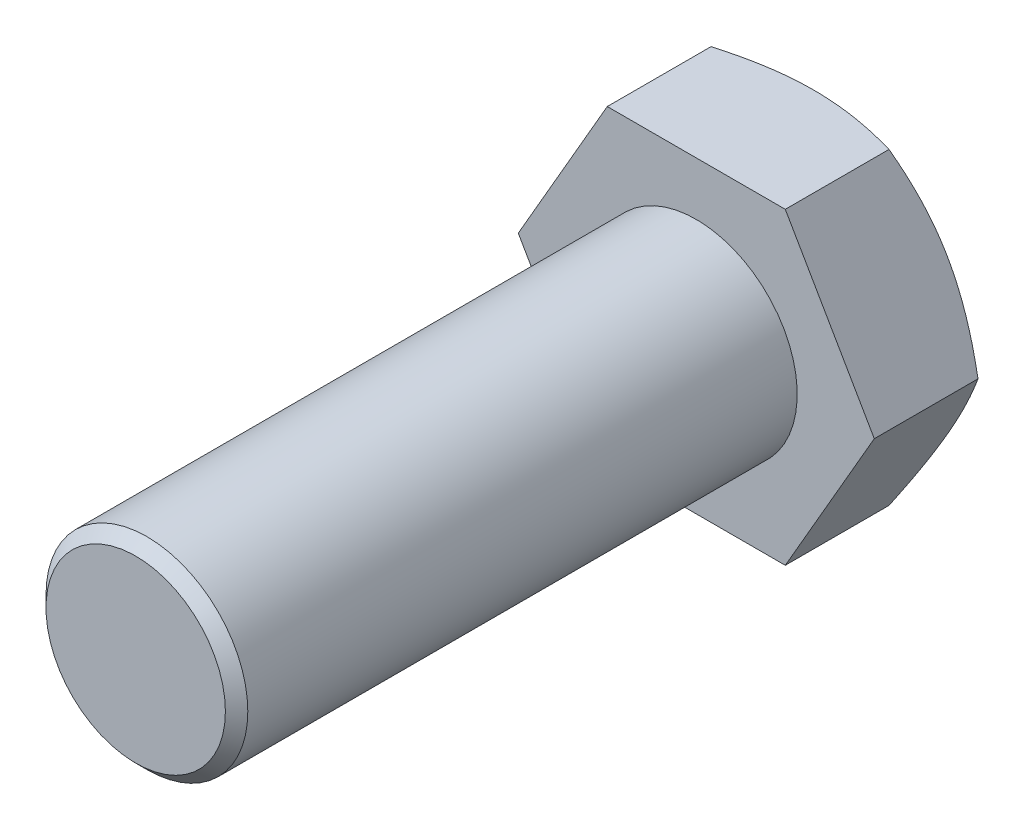
ISO-10303-21;
HEADER;
FILE_DESCRIPTION(('STEP AP214'),'2;1');
FILE_NAME('part.step','',(''),(''),'','','');
FILE_SCHEMA(('AUTOMOTIVE_DESIGN { 1 0 10303 214 1 1 1 1 }'));
ENDSEC;
DATA;
#1=APPLICATION_CONTEXT('core data for automotive mechanical design processes');
#2=APPLICATION_PROTOCOL_DEFINITION('international standard','automotive_design',2000,#1);
#3=PRODUCT_CONTEXT('',#1,'mechanical');
#4=PRODUCT('Part','Part','',(#3));
#5=PRODUCT_RELATED_PRODUCT_CATEGORY('part','',(#4));
#6=PRODUCT_DEFINITION_FORMATION('','',#4);
#7=PRODUCT_DEFINITION_CONTEXT('part definition',#1,'design');
#8=PRODUCT_DEFINITION('design','',#6,#7);
#9=PRODUCT_DEFINITION_SHAPE('','',#8);
#10=(LENGTH_UNIT() NAMED_UNIT(*) SI_UNIT(.MILLI.,.METRE.));
#11=(NAMED_UNIT(*) PLANE_ANGLE_UNIT() SI_UNIT($,.RADIAN.));
#12=(NAMED_UNIT(*) SI_UNIT($,.STERADIAN.) SOLID_ANGLE_UNIT());
#13=UNCERTAINTY_MEASURE_WITH_UNIT(LENGTH_MEASURE(1.E-05),#10,'distance_accuracy_value','');
#14=(GEOMETRIC_REPRESENTATION_CONTEXT(3) GLOBAL_UNCERTAINTY_ASSIGNED_CONTEXT((#13)) GLOBAL_UNIT_ASSIGNED_CONTEXT((#10,
#11,#12)) REPRESENTATION_CONTEXT('',''));
#15=CARTESIAN_POINT('',(0.,0.,0.));
#16=DIRECTION('',(0.,0.,1.));
#17=DIRECTION('',(1.,0.,0.));
#18=AXIS2_PLACEMENT_3D('',#15,#16,#17);
#19=CARTESIAN_POINT('',(15.8771324027147,-27.5,22.5));
#20=DIRECTION('',(-0.866025403784439,0.5,0.));
#21=DIRECTION('',(-0.5,-0.866025403784439,0.));
#22=AXIS2_PLACEMENT_3D('',#19,#20,#21);
#23=PLANE('',#22);
#24=CARTESIAN_POINT('',(31.7543802754833,0.000200000000014275,4.0000666670303));
#25=CARTESIAN_POINT('',(31.4054079553827,-0.604237788849373,3.79860242506894));
#26=CARTESIAN_POINT('',(31.0550744575329,-1.21103320671861,3.60628041248676));
#27=CARTESIAN_POINT('',(30.3515982095276,-2.42948981018163,3.24246204392051));
#28=CARTESIAN_POINT('',(29.9984545758749,-3.04115252603763,3.0709725374349));
#29=CARTESIAN_POINT('',(29.288668030154,-4.27053888575502,2.75112097915205));
#30=CARTESIAN_POINT('',(28.9320188501902,-4.8882733859301,2.60281415665774));
#31=CARTESIAN_POINT('',(28.2162574458172,-6.128008504401,2.33252283850917));
#32=CARTESIAN_POINT('',(27.8571454704538,-6.75000869133673,2.21053572066545));
#33=CARTESIAN_POINT('',(27.1456376531005,-7.9823763809752,1.99806197872558));
#34=CARTESIAN_POINT('',(26.7932945869289,-8.59265247327895,1.90687270210693));
#35=CARTESIAN_POINT('',(26.0869940021723,-9.81600097149301,1.75396926252744));
#36=CARTESIAN_POINT('',(25.7330364526428,-10.4290734310007,1.69225566693789));
#37=CARTESIAN_POINT('',(25.0245267818511,-11.6562481784659,1.59986182625365));
#38=CARTESIAN_POINT('',(24.66997587095,-12.2703483700163,1.56914470488069));
#39=CARTESIAN_POINT('',(23.960546874664,-13.4991154359462,1.53940437569927));
#40=CARTESIAN_POINT('',(23.6056687997282,-14.1137822922274,1.54038018849997));
#41=CARTESIAN_POINT('',(22.9422198524702,-15.2629095771062,1.57181198485078));
#42=CARTESIAN_POINT('',(22.6336017259233,-15.7974518524223,1.59843513827466));
#43=CARTESIAN_POINT('',(22.0171022601112,-16.8652602500478,1.67514515891808));
#44=CARTESIAN_POINT('',(21.7092209103562,-17.3985263905264,1.7252316900525));
#45=CARTESIAN_POINT('',(21.0943087503184,-18.4635854939038,1.84800042236973));
#46=CARTESIAN_POINT('',(20.7872789634531,-18.9953766841916,1.92070305585214));
#47=CARTESIAN_POINT('',(20.1746894958628,-20.0564127662394,2.08741729206136));
#48=CARTESIAN_POINT('',(19.8691298089152,-20.5856576687775,2.18142880450926));
#49=CARTESIAN_POINT('',(18.9415157523796,-22.1923323445123,2.49783930923249));
#50=CARTESIAN_POINT('',(18.3220968849487,-23.2651972940693,2.75180503572447));
#51=CARTESIAN_POINT('',(17.3998090934324,-24.8626466081761,3.18416962621692));
#52=CARTESIAN_POINT('',(17.0937841912214,-25.3926972871868,3.33670490708894));
#53=CARTESIAN_POINT('',(16.4838511067448,-26.4491323787176,3.65721775994824));
#54=CARTESIAN_POINT('',(16.1799423537135,-26.9755177798326,3.82519097955908));
#55=CARTESIAN_POINT('',(15.8770169326609,-27.5002,4.0000666670303));
#56=B_SPLINE_CURVE_WITH_KNOTS('',3,(#24,#25,#26,#27,#28,#29,#30,#31,#32,#33,#34,#35,#36,#37,#38,
#39,#40,#41,#42,#43,#44,#45,#46,#47,#48,#49,#50,#51,#52,#53,#54,#55),.UNSPECIFIED.,.F.,.F.,(4,2,
2,2,2,2,2,2,2,2,2,2,2,2,2,4),(0.,2.17937596004525,4.35946654657184,6.54467421858153,
8.72966408126494,10.8607692974364,12.9919155331585,15.120523359995,17.2490654075945,
19.1020483557859,20.9550047630006,22.8096400916025,24.6642675628548,28.4552152198911,
30.3473870339695,32.2390270200263),.UNSPECIFIED.);
#57=CARTESIAN_POINT('',(31.7542648054294,0.,4.));
#58=VERTEX_POINT('',#57);
#59=CARTESIAN_POINT('',(15.8771324027147,-27.5,4.));
#60=VERTEX_POINT('',#59);
#61=EDGE_CURVE('E82',#58,#60,#56,.T.);
#62=ORIENTED_EDGE('',*,*,#61,.F.);
#63=DIRECTION('',(0.,0.,-1.));
#64=VECTOR('',#63,1.);
#65=CARTESIAN_POINT('',(31.7542648054294,0.,22.5));
#66=LINE('',#65,#64);
#67=CARTESIAN_POINT('',(31.7542648054294,0.,22.5));
#68=VERTEX_POINT('',#67);
#69=EDGE_CURVE('E106',#68,#58,#66,.T.);
#70=ORIENTED_EDGE('',*,*,#69,.F.);
#71=DIRECTION('',(0.5,0.866025403784439,0.));
#72=VECTOR('',#71,1.);
#73=CARTESIAN_POINT('',(15.8771324027147,-27.5,22.5));
#74=LINE('',#73,#72);
#75=CARTESIAN_POINT('',(15.8771324027147,-27.5,22.5));
#76=VERTEX_POINT('',#75);
#77=EDGE_CURVE('E105',#76,#68,#74,.T.);
#78=ORIENTED_EDGE('',*,*,#77,.F.);
#79=DIRECTION('',(0.,0.,-1.));
#80=VECTOR('',#79,1.);
#81=CARTESIAN_POINT('',(15.8771324027147,-27.5,22.5));
#82=LINE('',#81,#80);
#83=EDGE_CURVE('E98',#76,#60,#82,.T.);
#84=ORIENTED_EDGE('',*,*,#83,.T.);
#85=EDGE_LOOP('',(#62,#70,#78,#84));
#86=FACE_BOUND('',#85,.T.);
#87=ADVANCED_FACE('F34',(#86),#23,.F.);
#88=CARTESIAN_POINT('',(31.7542648054294,0.,22.5));
#89=DIRECTION('',(-0.866025403784438,-0.5,0.));
#90=DIRECTION('',(0.5,-0.866025403784439,0.));
#91=AXIS2_PLACEMENT_3D('',#88,#89,#90);
#92=PLANE('',#91);
#93=CARTESIAN_POINT('',(15.8770169326609,27.5002,4.0000666670303));
#94=CARTESIAN_POINT('',(16.2259892527614,26.8957622111506,3.79860242506894));
#95=CARTESIAN_POINT('',(16.5763227506113,26.2889667932814,3.60628041248676));
#96=CARTESIAN_POINT('',(17.2797989986165,25.0705101898184,3.24246204392051));
#97=CARTESIAN_POINT('',(17.6329426322693,24.4588474739624,3.0709725374349));
#98=CARTESIAN_POINT('',(18.3427291779901,23.229461114245,2.75112097915205));
#99=CARTESIAN_POINT('',(18.6993783579539,22.6117266140699,2.60281415665775));
#100=CARTESIAN_POINT('',(19.4151397623269,21.371991495599,2.33252283850918));
#101=CARTESIAN_POINT('',(19.7742517376903,20.7499913086633,2.21053572066545));
#102=CARTESIAN_POINT('',(20.4857595550437,19.5176236190248,1.99806197872559));
#103=CARTESIAN_POINT('',(20.8381026212152,18.9073475267211,1.90687270210693));
#104=CARTESIAN_POINT('',(21.5444032059718,17.683999028507,1.75396926252744));
#105=CARTESIAN_POINT('',(21.8983607555014,17.0709265689993,1.6922556669379));
#106=CARTESIAN_POINT('',(22.6068704262931,15.8437518215341,1.59986182625366));
#107=CARTESIAN_POINT('',(22.9614213371941,15.2296516299837,1.56914470488069));
#108=CARTESIAN_POINT('',(23.6708503334801,14.0008845640538,1.53940437569927));
#109=CARTESIAN_POINT('',(24.025728408416,13.3862177077726,1.54038018849998));
#110=CARTESIAN_POINT('',(24.6891773556739,12.2370904228938,1.57181198485078));
#111=CARTESIAN_POINT('',(24.9977954822209,11.7025481475777,1.59843513827466));
#112=CARTESIAN_POINT('',(25.6142949480329,10.6347397499522,1.67514515891808));
#113=CARTESIAN_POINT('',(25.9221762977879,10.1014736094737,1.72523169005251));
#114=CARTESIAN_POINT('',(26.5370884578257,9.03641450609622,1.84800042236974));
#115=CARTESIAN_POINT('',(26.8441182446911,8.50462331580839,1.92070305585215));
#116=CARTESIAN_POINT('',(27.4567077122813,7.44358723376059,2.08741729206136));
#117=CARTESIAN_POINT('',(27.7622673992289,6.91434233122251,2.18142880450927));
#118=CARTESIAN_POINT('',(28.6898814557645,5.30766765548771,2.49783930923249));
#119=CARTESIAN_POINT('',(29.3093003231954,4.23480270593066,2.75180503572448));
#120=CARTESIAN_POINT('',(30.2315881147117,2.63735339182394,3.18416962621692));
#121=CARTESIAN_POINT('',(30.5376130169227,2.10730271281317,3.33670490708894));
#122=CARTESIAN_POINT('',(31.1475461013994,1.0508676212824,3.65721775994825));
#123=CARTESIAN_POINT('',(31.4514548544306,0.524482220167436,3.82519097955908));
#124=CARTESIAN_POINT('',(31.7543802754833,-0.000199999999984533,4.0000666670303));
#125=B_SPLINE_CURVE_WITH_KNOTS('',3,(#93,#94,#95,#96,#97,#98,#99,#100,#101,#102,#103,#104,#105,
#106,#107,#108,#109,#110,#111,#112,#113,#114,#115,#116,#117,#118,#119,#120,#121,#122,#123,#124),
.UNSPECIFIED.,.F.,.F.,(4,2,2,2,2,2,2,2,2,2,2,2,2,2,2,4),(0.,2.17937596004525,4.35946654657184,
6.54467421858153,8.72966408126494,10.8607692974364,12.9919155331585,15.120523359995,
17.2490654075945,19.1020483557859,20.9550047630006,22.8096400916025,24.6642675628548,
28.4552152198911,30.3473870339695,32.2390270200263),.UNSPECIFIED.);
#126=CARTESIAN_POINT('',(15.8771324027147,27.5,4.));
#127=VERTEX_POINT('',#126);
#128=EDGE_CURVE('E49',#127,#58,#125,.T.);
#129=ORIENTED_EDGE('',*,*,#128,.F.);
#130=DIRECTION('',(0.,0.,-1.));
#131=VECTOR('',#130,1.);
#132=CARTESIAN_POINT('',(15.8771324027147,27.5,22.5));
#133=LINE('',#132,#131);
#134=CARTESIAN_POINT('',(15.8771324027147,27.5,22.5));
#135=VERTEX_POINT('',#134);
#136=EDGE_CURVE('E108',#135,#127,#133,.T.);
#137=ORIENTED_EDGE('',*,*,#136,.F.);
#138=DIRECTION('',(-0.5,0.866025403784438,0.));
#139=VECTOR('',#138,1.);
#140=CARTESIAN_POINT('',(31.7542648054294,0.,22.5));
#141=LINE('',#140,#139);
#142=EDGE_CURVE('E132',#68,#135,#141,.T.);
#143=ORIENTED_EDGE('',*,*,#142,.F.);
#144=ORIENTED_EDGE('',*,*,#69,.T.);
#145=EDGE_LOOP('',(#129,#137,#143,#144));
#146=FACE_BOUND('',#145,.T.);
#147=ADVANCED_FACE('F178',(#146),#92,.F.);
#148=CARTESIAN_POINT('',(15.8771324027147,27.5,22.5));
#149=DIRECTION('',(0.,-1.,0.));
#150=DIRECTION('',(1.,0.,0.));
#151=AXIS2_PLACEMENT_3D('',#148,#149,#150);
#152=PLANE('',#151);
#153=CARTESIAN_POINT('',(-41.8947454678366,27.5,14.6000366617363));
#154=CARTESIAN_POINT('',(-41.2972373909663,27.5,14.3116534517566));
#155=CARTESIAN_POINT('',(-40.6990068929886,27.5,14.0247623738564));
#156=CARTESIAN_POINT('',(-39.5009511300616,27.5,13.4543136502321));
#157=CARTESIAN_POINT('',(-38.9011258479095,27.5,13.1707560406461));
#158=CARTESIAN_POINT('',(-37.699644265307,27.5,12.6072831310829));
#159=CARTESIAN_POINT('',(-37.0979876786622,27.5,12.3273684407369));
#160=CARTESIAN_POINT('',(-35.8927818899799,27.5,11.7716495819908));
#161=CARTESIAN_POINT('',(-35.2892326926426,27.5,11.4958454033925));
#162=CARTESIAN_POINT('',(-33.4685027344423,27.5,10.6721240752368));
#163=CARTESIAN_POINT('',(-32.2481635726962,27.5,10.1311578779396));
#164=CARTESIAN_POINT('',(-29.7975060167707,27.5,9.0723649083398));
#165=CARTESIAN_POINT('',(-28.5671881213292,27.5,8.55453698790237));
#166=CARTESIAN_POINT('',(-26.6944828297253,27.5,7.79238620628073));
#167=CARTESIAN_POINT('',(-26.0564838638613,27.5,7.53726979622732));
#168=CARTESIAN_POINT('',(-24.7770243788651,27.5,7.03588145327263));
#169=CARTESIAN_POINT('',(-24.1355639157578,27.5,6.78960937771539));
#170=CARTESIAN_POINT('',(-22.8487781022656,27.5,6.30705873165252));
#171=CARTESIAN_POINT('',(-22.2034521877735,27.5,6.07078166244334));
#172=CARTESIAN_POINT('',(-20.9087477586919,27.5,5.609636589235));
#173=CARTESIAN_POINT('',(-20.259369341555,27.5,5.38476831206084));
#174=CARTESIAN_POINT('',(-18.957662124008,27.5,4.94846055805869));
#175=CARTESIAN_POINT('',(-18.3053427862327,27.5,4.73699299433834));
#176=CARTESIAN_POINT('',(-16.9961481428003,27.5,4.32871044661211));
#177=CARTESIAN_POINT('',(-16.3392727572,27.5,4.1318957204288));
#178=CARTESIAN_POINT('',(-14.361833697016,27.5,3.56639269386102));
#179=CARTESIAN_POINT('',(-13.0339381127029,27.5,3.22246847936502));
#180=CARTESIAN_POINT('',(-11.031434756771,27.5,2.76996204973804));
#181=CARTESIAN_POINT('',(-10.3638442239196,27.5,2.62996226799984));
#182=CARTESIAN_POINT('',(-9.02424446808466,27.5,2.37283291197602));
#183=CARTESIAN_POINT('',(-8.35223534476824,27.5,2.25570282365141));
#184=CARTESIAN_POINT('',(-7.0043332360254,27.5,2.04642483892903));
#185=CARTESIAN_POINT('',(-6.32844032392664,27.5,1.95427647243757));
#186=CARTESIAN_POINT('',(-4.97351254051255,27.5,1.79682019393029));
#187=CARTESIAN_POINT('',(-4.29447766919676,27.5,1.73151228191837));
#188=CARTESIAN_POINT('',(-2.94278198682926,27.5,1.62981846339272));
#189=CARTESIAN_POINT('',(-2.27014780593405,27.5,1.59308070477978));
#190=CARTESIAN_POINT('',(-0.923932546833292,27.5,1.54801975808308));
#191=CARTESIAN_POINT('',(-0.250351483717539,27.5,1.53969612220565));
#192=CARTESIAN_POINT('',(1.0965696784698,27.5,1.55166026690573));
#193=CARTESIAN_POINT('',(1.76990977333863,27.5,1.57194852429789));
#194=CARTESIAN_POINT('',(3.11515843216522,27.5,1.64065650370869));
#195=CARTESIAN_POINT('',(3.78706692981889,27.5,1.68907750143552));
#196=CARTESIAN_POINT('',(5.42532233336094,27.5,1.84043981947151));
#197=CARTESIAN_POINT('',(6.39033802104638,27.5,1.95802743528601));
#198=CARTESIAN_POINT('',(8.31270703745941,27.5,2.24464081506787));
#199=CARTESIAN_POINT('',(9.27005920453821,27.5,2.41367423122309));
#200=CARTESIAN_POINT('',(11.1763609746558,27.5,2.79716440636782));
#201=CARTESIAN_POINT('',(12.1253029502191,27.5,3.0116587223953));
#202=CARTESIAN_POINT('',(14.0134303866352,27.5,3.47957263526603));
#203=CARTESIAN_POINT('',(14.9526160440281,27.5,3.73299144634874));
#204=CARTESIAN_POINT('',(16.8415518462086,27.5,4.27853159327815));
#205=CARTESIAN_POINT('',(17.7910937558704,27.5,4.57136903835435));
#206=CARTESIAN_POINT('',(19.6808199103929,27.5,5.18567361532166));
#207=CARTESIAN_POINT('',(20.6210040951731,27.5,5.50714093089684));
#208=CARTESIAN_POINT('',(22.4925084364906,27.5,6.17374483703701));
#209=CARTESIAN_POINT('',(23.4238317765158,27.5,6.51887253076572));
#210=CARTESIAN_POINT('',(25.2788712866893,27.5,7.22889736074899));
#211=CARTESIAN_POINT('',(26.2025875272759,27.5,7.59379431371171));
#212=CARTESIAN_POINT('',(28.300023820881,27.5,8.44412832791786));
#213=CARTESIAN_POINT('',(29.4716178131359,27.5,8.93480023200263));
#214=CARTESIAN_POINT('',(31.8055987556465,27.5,9.93763024061144));
#215=CARTESIAN_POINT('',(32.9679852561527,27.5,10.4497893871018));
#216=CARTESIAN_POINT('',(35.2851719751702,27.5,11.4914928346583));
#217=CARTESIAN_POINT('',(36.4399708060819,27.5,12.0210402149412));
#218=CARTESIAN_POINT('',(38.7429827226563,27.5,13.0941875355533));
#219=CARTESIAN_POINT('',(39.8911959173483,27.5,13.6377872424121));
#220=CARTESIAN_POINT('',(42.1831397378351,27.5,14.7370414347066));
#221=CARTESIAN_POINT('',(43.3268652133734,27.5,15.2927066415259));
#222=CARTESIAN_POINT('',(45.6096076210853,27.5,16.4136234156035));
#223=CARTESIAN_POINT('',(46.7486245374791,27.5,16.9788750149565));
#224=CARTESIAN_POINT('',(49.0225272272282,27.5,18.1173354761567));
#225=CARTESIAN_POINT('',(50.1574134050976,27.5,18.6905435308553));
#226=CARTESIAN_POINT('',(52.4237428699914,27.5,19.8437164397739));
#227=CARTESIAN_POINT('',(53.5551861621289,27.5,20.4236812839531));
#228=CARTESIAN_POINT('',(55.7274104822851,27.5,21.5441204259652));
#229=CARTESIAN_POINT('',(56.7684126856515,27.5,22.0841662241522));
#230=CARTESIAN_POINT('',(58.8482068048337,27.5,23.1684985960758));
#231=CARTESIAN_POINT('',(59.8869987172166,27.5,23.7127851763925));
#232=CARTESIAN_POINT('',(63.000524713802,27.5,25.3511917747704));
#233=CARTESIAN_POINT('',(65.072355804398,27.5,26.4508311076314));
#234=CARTESIAN_POINT('',(68.173332769684,27.5,28.1076119477957));
#235=CARTESIAN_POINT('',(69.204759854292,27.5,28.6604950978634));
#236=CARTESIAN_POINT('',(71.2662623123325,27.5,29.7687778050727));
#237=CARTESIAN_POINT('',(72.2963376853073,27.5,30.324177363066));
#238=CARTESIAN_POINT('',(74.3552332450533,27.5,31.4371812281622));
#239=CARTESIAN_POINT('',(75.3840534887651,27.5,31.9947854299817));
#240=CARTESIAN_POINT('',(77.4406063539136,27.5,33.111992360419));
#241=CARTESIAN_POINT('',(78.4683389770089,27.5,33.6715950859835));
#242=CARTESIAN_POINT('',(79.4955887943185,27.5,34.2320817881131));
#243=B_SPLINE_CURVE_WITH_KNOTS('',3,(#153,#154,#155,#156,#157,#158,#159,#160,#161,#162,#163,
#164,#165,#166,#167,#168,#169,#170,#171,#172,#173,#174,#175,#176,#177,#178,#179,#180,#181,#182,
#183,#184,#185,#186,#187,#188,#189,#190,#191,#192,#193,#194,#195,#196,#197,#198,#199,#200,#201,
#202,#203,#204,#205,#206,#207,#208,#209,#210,#211,#212,#213,#214,#215,#216,#217,#218,#219,#220,
#221,#222,#223,#224,#225,#226,#227,#228,#229,#230,#231,#232,#233,#234,#235,#236,#237,#238,#239,
#240,#241,#242),.UNSPECIFIED.,.F.,.F.,(4,2,2,2,2,2,2,2,2,2,2,2,2,2,2,2,2,2,2,2,2,2,2,2,2,2,2,2,
2,2,2,2,2,2,2,2,2,2,2,2,2,2,2,2,4),(0.,1.99038444929256,3.98079045650995,5.97152537634549,
7.96225535635473,11.9666718953306,15.9708895116643,18.0321811133201,20.0934394521325,
22.155006310082,24.2165237820354,26.2735668873462,28.3306461786082,32.4431610730889,
34.4891829306632,36.5351587947861,38.5810961560741,40.6270335176602,42.6473568208031,
44.6676482844216,46.6879734164152,48.7083901692911,51.6232202935196,54.53848418955,
57.4561659535506,60.3737888266659,63.3542610743565,66.3347524455965,69.3141291676776,
72.2934782710205,76.1037752784245,79.9142572700439,83.7254177238481,87.5365148983341,
91.3511496986098,95.1657972725791,98.9800606545812,102.794318369202,106.312547641374,
109.830782373659,116.867431695817,120.378226684208,123.889022860959,127.399653356415,
130.910278490591),.UNSPECIFIED.);
#244=CARTESIAN_POINT('',(-15.8771324027147,27.5,4.));
#245=VERTEX_POINT('',#244);
#246=EDGE_CURVE('E54',#245,#127,#243,.T.);
#247=ORIENTED_EDGE('',*,*,#246,.F.);
#248=DIRECTION('',(0.,0.,-1.));
#249=VECTOR('',#248,1.);
#250=CARTESIAN_POINT('',(-15.8771324027147,27.5,22.5));
#251=LINE('',#250,#249);
#252=CARTESIAN_POINT('',(-15.8771324027147,27.5,22.5));
#253=VERTEX_POINT('',#252);
#254=EDGE_CURVE('E192',#253,#245,#251,.T.);
#255=ORIENTED_EDGE('',*,*,#254,.F.);
#256=DIRECTION('',(-1.,0.,0.));
#257=VECTOR('',#256,1.);
#258=CARTESIAN_POINT('',(15.8771324027147,27.5,22.5));
#259=LINE('',#258,#257);
#260=EDGE_CURVE('E130',#135,#253,#259,.T.);
#261=ORIENTED_EDGE('',*,*,#260,.F.);
#262=ORIENTED_EDGE('',*,*,#136,.T.);
#263=EDGE_LOOP('',(#247,#255,#261,#262));
#264=FACE_BOUND('',#263,.T.);
#265=ADVANCED_FACE('F174',(#264),#152,.F.);
#266=CARTESIAN_POINT('',(-15.8771324027147,27.5,22.5));
#267=DIRECTION('',(0.866025403784439,-0.5,0.));
#268=DIRECTION('',(0.5,0.866025403784439,0.));
#269=AXIS2_PLACEMENT_3D('',#266,#267,#268);
#270=PLANE('',#269);
#271=CARTESIAN_POINT('',(-31.7543802754833,-0.000200000000003744,4.0000666670303));
#272=CARTESIAN_POINT('',(-31.4054079553827,0.604237788849384,3.79860242506894));
#273=CARTESIAN_POINT('',(-31.0550744575329,1.21103320671862,3.60628041248676));
#274=CARTESIAN_POINT('',(-30.3515982095276,2.42948981018164,3.24246204392051));
#275=CARTESIAN_POINT('',(-29.9984545758749,3.04115252603764,3.0709725374349));
#276=CARTESIAN_POINT('',(-29.288668030154,4.27053888575503,2.75112097915205));
#277=CARTESIAN_POINT('',(-28.9320188501902,4.88827338593011,2.60281415665775));
#278=CARTESIAN_POINT('',(-28.2162574458172,6.128008504401,2.33252283850918));
#279=CARTESIAN_POINT('',(-27.8571454704538,6.75000869133674,2.21053572066545));
#280=CARTESIAN_POINT('',(-27.1456376531005,7.98237638097521,1.99806197872558));
#281=CARTESIAN_POINT('',(-26.7932945869289,8.59265247327896,1.90687270210693));
#282=CARTESIAN_POINT('',(-26.0869940021723,9.81600097149303,1.75396926252744));
#283=CARTESIAN_POINT('',(-25.7330364526428,10.4290734310007,1.69225566693789));
#284=CARTESIAN_POINT('',(-25.0245267818511,11.6562481784659,1.59986182625366));
#285=CARTESIAN_POINT('',(-24.66997587095,12.2703483700163,1.56914470488069));
#286=CARTESIAN_POINT('',(-23.960546874664,13.4991154359462,1.53940437569927));
#287=CARTESIAN_POINT('',(-23.6056687997282,14.1137822922274,1.54038018849997));
#288=CARTESIAN_POINT('',(-22.9422198524702,15.2629095771062,1.57181198485078));
#289=CARTESIAN_POINT('',(-22.6336017259233,15.7974518524223,1.59843513827466));
#290=CARTESIAN_POINT('',(-22.0171022601112,16.8652602500478,1.67514515891808));
#291=CARTESIAN_POINT('',(-21.7092209103562,17.3985263905264,1.7252316900525));
#292=CARTESIAN_POINT('',(-21.0943087503184,18.4635854939038,1.84800042236974));
#293=CARTESIAN_POINT('',(-20.787278963453,18.9953766841916,1.92070305585214));
#294=CARTESIAN_POINT('',(-20.1746894958628,20.0564127662394,2.08741729206136));
#295=CARTESIAN_POINT('',(-19.8691298089152,20.5856576687775,2.18142880450927));
#296=CARTESIAN_POINT('',(-18.9415157523796,22.1923323445123,2.49783930923249));
#297=CARTESIAN_POINT('',(-18.3220968849487,23.2651972940694,2.75180503572448));
#298=CARTESIAN_POINT('',(-17.3998090934324,24.8626466081761,3.18416962621692));
#299=CARTESIAN_POINT('',(-17.0937841912214,25.3926972871868,3.33670490708894));
#300=CARTESIAN_POINT('',(-16.4838511067448,26.4491323787176,3.65721775994825));
#301=CARTESIAN_POINT('',(-16.1799423537135,26.9755177798326,3.82519097955908));
#302=CARTESIAN_POINT('',(-15.8770169326609,27.5002,4.0000666670303));
#303=B_SPLINE_CURVE_WITH_KNOTS('',3,(#271,#272,#273,#274,#275,#276,#277,#278,#279,#280,#281,
#282,#283,#284,#285,#286,#287,#288,#289,#290,#291,#292,#293,#294,#295,#296,#297,#298,#299,#300,
#301,#302),.UNSPECIFIED.,.F.,.F.,(4,2,2,2,2,2,2,2,2,2,2,2,2,2,2,4),(0.,2.17937596004525,
4.35946654657184,6.54467421858153,8.72966408126494,10.8607692974364,12.9919155331585,
15.120523359995,17.2490654075945,19.1020483557859,20.9550047630006,22.8096400916025,
24.6642675628548,28.4552152198911,30.3473870339695,32.2390270200263),.UNSPECIFIED.);
#304=CARTESIAN_POINT('',(-31.7542648054294,0.,4.));
#305=VERTEX_POINT('',#304);
#306=EDGE_CURVE('E165',#305,#245,#303,.T.);
#307=ORIENTED_EDGE('',*,*,#306,.F.);
#308=DIRECTION('',(0.,0.,-1.));
#309=VECTOR('',#308,1.);
#310=CARTESIAN_POINT('',(-31.7542648054294,0.,22.5));
#311=LINE('',#310,#309);
#312=CARTESIAN_POINT('',(-31.7542648054294,0.,22.5));
#313=VERTEX_POINT('',#312);
#314=EDGE_CURVE('E194',#313,#305,#311,.T.);
#315=ORIENTED_EDGE('',*,*,#314,.F.);
#316=DIRECTION('',(-0.5,-0.866025403784439,0.));
#317=VECTOR('',#316,1.);
#318=CARTESIAN_POINT('',(-15.8771324027147,27.5,22.5));
#319=LINE('',#318,#317);
#320=EDGE_CURVE('E128',#253,#313,#319,.T.);
#321=ORIENTED_EDGE('',*,*,#320,.F.);
#322=ORIENTED_EDGE('',*,*,#254,.T.);
#323=EDGE_LOOP('',(#307,#315,#321,#322));
#324=FACE_BOUND('',#323,.T.);
#325=ADVANCED_FACE('F177',(#324),#270,.F.);
#326=CARTESIAN_POINT('',(-31.7542648054294,0.,22.5));
#327=DIRECTION('',(0.866025403784438,0.5,0.));
#328=DIRECTION('',(-0.5,0.866025403784439,0.));
#329=AXIS2_PLACEMENT_3D('',#326,#327,#328);
#330=PLANE('',#329);
#331=CARTESIAN_POINT('',(-15.8770169326609,-27.5002,4.0000666670303));
#332=CARTESIAN_POINT('',(-16.2259892527614,-26.8957622111506,3.79860242506893));
#333=CARTESIAN_POINT('',(-16.5763227506113,-26.2889667932814,3.60628041248676));
#334=CARTESIAN_POINT('',(-17.2797989986165,-25.0705101898184,3.2424620439205));
#335=CARTESIAN_POINT('',(-17.6329426322692,-24.4588474739624,3.0709725374349));
#336=CARTESIAN_POINT('',(-18.3427291779901,-23.229461114245,2.75112097915205));
#337=CARTESIAN_POINT('',(-18.6993783579539,-22.6117266140699,2.60281415665774));
#338=CARTESIAN_POINT('',(-19.4151397623269,-21.371991495599,2.33252283850917));
#339=CARTESIAN_POINT('',(-19.7742517376903,-20.7499913086633,2.21053572066544));
#340=CARTESIAN_POINT('',(-20.4857595550437,-19.5176236190248,1.99806197872558));
#341=CARTESIAN_POINT('',(-20.8381026212152,-18.907347526721,1.90687270210693));
#342=CARTESIAN_POINT('',(-21.5444032059718,-17.683999028507,1.75396926252744));
#343=CARTESIAN_POINT('',(-21.8983607555014,-17.0709265689993,1.69225566693789));
#344=CARTESIAN_POINT('',(-22.6068704262931,-15.8437518215341,1.59986182625365));
#345=CARTESIAN_POINT('',(-22.9614213371941,-15.2296516299837,1.56914470488069));
#346=CARTESIAN_POINT('',(-23.6708503334801,-14.0008845640538,1.53940437569927));
#347=CARTESIAN_POINT('',(-24.025728408416,-13.3862177077726,1.54038018849997));
#348=CARTESIAN_POINT('',(-24.6891773556739,-12.2370904228938,1.57181198485078));
#349=CARTESIAN_POINT('',(-24.9977954822209,-11.7025481475777,1.59843513827465));
#350=CARTESIAN_POINT('',(-25.6142949480329,-10.6347397499522,1.67514515891808));
#351=CARTESIAN_POINT('',(-25.9221762977879,-10.1014736094736,1.7252316900525));
#352=CARTESIAN_POINT('',(-26.5370884578257,-9.03641450609622,1.84800042236974));
#353=CARTESIAN_POINT('',(-26.8441182446911,-8.50462331580839,1.92070305585214));
#354=CARTESIAN_POINT('',(-27.4567077122813,-7.44358723376058,2.08741729206136));
#355=CARTESIAN_POINT('',(-27.7622673992289,-6.9143423312225,2.18142880450927));
#356=CARTESIAN_POINT('',(-28.6898814557645,-5.3076676554877,2.49783930923249));
#357=CARTESIAN_POINT('',(-29.3093003231954,-4.23480270593065,2.75180503572447));
#358=CARTESIAN_POINT('',(-30.2315881147117,-2.63735339182392,3.18416962621692));
#359=CARTESIAN_POINT('',(-30.5376130169227,-2.10730271281316,3.33670490708894));
#360=CARTESIAN_POINT('',(-31.1475461013994,-1.05086762128239,3.65721775994825));
#361=CARTESIAN_POINT('',(-31.4514548544306,-0.524482220167425,3.82519097955908));
#362=CARTESIAN_POINT('',(-31.7543802754833,0.000199999999995443,4.0000666670303));
#363=B_SPLINE_CURVE_WITH_KNOTS('',3,(#331,#332,#333,#334,#335,#336,#337,#338,#339,#340,#341,
#342,#343,#344,#345,#346,#347,#348,#349,#350,#351,#352,#353,#354,#355,#356,#357,#358,#359,#360,
#361,#362),.UNSPECIFIED.,.F.,.F.,(4,2,2,2,2,2,2,2,2,2,2,2,2,2,2,4),(0.,2.17937596004525,
4.35946654657184,6.54467421858153,8.72966408126494,10.8607692974364,12.9919155331585,
15.120523359995,17.2490654075945,19.1020483557859,20.9550047630006,22.8096400916025,
24.6642675628548,28.4552152198911,30.3473870339695,32.2390270200263),.UNSPECIFIED.);
#364=CARTESIAN_POINT('',(-15.8771324027147,-27.5,4.));
#365=VERTEX_POINT('',#364);
#366=EDGE_CURVE('E102',#365,#305,#363,.T.);
#367=ORIENTED_EDGE('',*,*,#366,.F.);
#368=DIRECTION('',(0.,0.,-1.));
#369=VECTOR('',#368,1.);
#370=CARTESIAN_POINT('',(-15.8771324027147,-27.5,22.5));
#371=LINE('',#370,#369);
#372=CARTESIAN_POINT('',(-15.8771324027147,-27.5,22.5));
#373=VERTEX_POINT('',#372);
#374=EDGE_CURVE('E101',#373,#365,#371,.T.);
#375=ORIENTED_EDGE('',*,*,#374,.F.);
#376=DIRECTION('',(0.5,-0.866025403784439,0.));
#377=VECTOR('',#376,1.);
#378=CARTESIAN_POINT('',(-31.7542648054294,0.,22.5));
#379=LINE('',#378,#377);
#380=EDGE_CURVE('E126',#313,#373,#379,.T.);
#381=ORIENTED_EDGE('',*,*,#380,.F.);
#382=ORIENTED_EDGE('',*,*,#314,.T.);
#383=EDGE_LOOP('',(#367,#375,#381,#382));
#384=FACE_BOUND('',#383,.T.);
#385=ADVANCED_FACE('F200',(#384),#330,.F.);
#386=CARTESIAN_POINT('',(-15.8771324027147,-27.5,22.5));
#387=DIRECTION('',(0.,1.,0.));
#388=DIRECTION('',(0.,0.,1.));
#389=AXIS2_PLACEMENT_3D('',#386,#387,#388);
#390=PLANE('',#389);
#391=CARTESIAN_POINT('',(-41.8947454678366,-27.5,14.6000366617363));
#392=CARTESIAN_POINT('',(-41.2972373909663,-27.5,14.3116534517566));
#393=CARTESIAN_POINT('',(-40.6990068929886,-27.5,14.0247623738564));
#394=CARTESIAN_POINT('',(-39.5009511300616,-27.5,13.4543136502321));
#395=CARTESIAN_POINT('',(-38.9011258479095,-27.5,13.1707560406461));
#396=CARTESIAN_POINT('',(-37.699644265307,-27.5,12.6072831310829));
#397=CARTESIAN_POINT('',(-37.0979876786622,-27.5,12.3273684407369));
#398=CARTESIAN_POINT('',(-35.8927818899799,-27.5,11.7716495819908));
#399=CARTESIAN_POINT('',(-35.2892326926426,-27.5,11.4958454033925));
#400=CARTESIAN_POINT('',(-33.4685027344423,-27.5,10.6721240752368));
#401=CARTESIAN_POINT('',(-32.2481635726962,-27.5,10.1311578779396));
#402=CARTESIAN_POINT('',(-29.7975060167707,-27.5,9.0723649083398));
#403=CARTESIAN_POINT('',(-28.5671881213292,-27.5,8.55453698790237));
#404=CARTESIAN_POINT('',(-26.6944828297253,-27.5,7.79238620628073));
#405=CARTESIAN_POINT('',(-26.0564838638613,-27.5,7.53726979622732));
#406=CARTESIAN_POINT('',(-24.7770243788651,-27.5,7.03588145327263));
#407=CARTESIAN_POINT('',(-24.1355639157578,-27.5,6.78960937771539));
#408=CARTESIAN_POINT('',(-22.8487781022656,-27.5,6.30705873165252));
#409=CARTESIAN_POINT('',(-22.2034521877735,-27.5,6.07078166244334));
#410=CARTESIAN_POINT('',(-20.9087477586919,-27.5,5.609636589235));
#411=CARTESIAN_POINT('',(-20.259369341555,-27.5,5.38476831206084));
#412=CARTESIAN_POINT('',(-18.957662124008,-27.5,4.94846055805869));
#413=CARTESIAN_POINT('',(-18.3053427862326,-27.5,4.73699299433834));
#414=CARTESIAN_POINT('',(-16.9961481428003,-27.5,4.32871044661211));
#415=CARTESIAN_POINT('',(-16.3392727572,-27.5,4.13189572042879));
#416=CARTESIAN_POINT('',(-14.361833697016,-27.5,3.56639269386102));
#417=CARTESIAN_POINT('',(-13.0339381127028,-27.5,3.22246847936502));
#418=CARTESIAN_POINT('',(-11.031434756771,-27.5,2.76996204973804));
#419=CARTESIAN_POINT('',(-10.3638442239196,-27.5,2.62996226799983));
#420=CARTESIAN_POINT('',(-9.02424446808464,-27.5,2.37283291197601));
#421=CARTESIAN_POINT('',(-8.35223534476823,-27.5,2.2557028236514));
#422=CARTESIAN_POINT('',(-7.00433323602539,-27.5,2.04642483892902));
#423=CARTESIAN_POINT('',(-6.32844032392662,-27.5,1.95427647243757));
#424=CARTESIAN_POINT('',(-4.97351254051253,-27.5,1.79682019393028));
#425=CARTESIAN_POINT('',(-4.29447766919675,-27.5,1.73151228191837));
#426=CARTESIAN_POINT('',(-2.94278198682925,-27.5,1.62981846339272));
#427=CARTESIAN_POINT('',(-2.27014780593405,-27.5,1.59308070477978));
#428=CARTESIAN_POINT('',(-0.923932546833284,-27.5,1.54801975808307));
#429=CARTESIAN_POINT('',(-0.250351483717531,-27.5,1.53969612220564));
#430=CARTESIAN_POINT('',(1.09656967846981,-27.5,1.55166026690572));
#431=CARTESIAN_POINT('',(1.76990977333864,-27.5,1.57194852429788));
#432=CARTESIAN_POINT('',(3.11515843216523,-27.5,1.64065650370869));
#433=CARTESIAN_POINT('',(3.78706692981889,-27.5,1.68907750143552));
#434=CARTESIAN_POINT('',(5.42532233336095,-27.5,1.8404398194715));
#435=CARTESIAN_POINT('',(6.39033802104638,-27.5,1.95802743528601));
#436=CARTESIAN_POINT('',(8.31270703745942,-27.5,2.24464081506787));
#437=CARTESIAN_POINT('',(9.27005920453822,-27.5,2.41367423122309));
#438=CARTESIAN_POINT('',(11.1763609746558,-27.5,2.79716440636782));
#439=CARTESIAN_POINT('',(12.1253029502191,-27.5,3.01165872239529));
#440=CARTESIAN_POINT('',(14.0134303866352,-27.5,3.47957263526602));
#441=CARTESIAN_POINT('',(14.9526160440281,-27.5,3.73299144634873));
#442=CARTESIAN_POINT('',(16.8415518462086,-27.5,4.27853159327814));
#443=CARTESIAN_POINT('',(17.7910937558704,-27.5,4.57136903835435));
#444=CARTESIAN_POINT('',(19.6808199103929,-27.5,5.18567361532165));
#445=CARTESIAN_POINT('',(20.6210040951731,-27.5,5.50714093089683));
#446=CARTESIAN_POINT('',(22.4925084364906,-27.5,6.17374483703701));
#447=CARTESIAN_POINT('',(23.4238317765158,-27.5,6.51887253076572));
#448=CARTESIAN_POINT('',(25.2788712866893,-27.5,7.22889736074899));
#449=CARTESIAN_POINT('',(26.2025875272759,-27.5,7.59379431371171));
#450=CARTESIAN_POINT('',(28.300023820881,-27.5,8.44412832791786));
#451=CARTESIAN_POINT('',(29.4716178131359,-27.5,8.93480023200264));
#452=CARTESIAN_POINT('',(31.8055987556465,-27.5,9.93763024061144));
#453=CARTESIAN_POINT('',(32.9679852561527,-27.5,10.4497893871018));
#454=CARTESIAN_POINT('',(35.2851719751702,-27.5,11.4914928346583));
#455=CARTESIAN_POINT('',(36.439970806082,-27.5,12.0210402149412));
#456=CARTESIAN_POINT('',(38.7429827226564,-27.5,13.0941875355533));
#457=CARTESIAN_POINT('',(39.8911959173483,-27.5,13.6377872424121));
#458=CARTESIAN_POINT('',(42.1831397378352,-27.5,14.7370414347066));
#459=CARTESIAN_POINT('',(43.3268652133735,-27.5,15.2927066415259));
#460=CARTESIAN_POINT('',(45.6096076210854,-27.5,16.4136234156035));
#461=CARTESIAN_POINT('',(46.7486245374792,-27.5,16.9788750149565));
#462=CARTESIAN_POINT('',(49.0225272272282,-27.5,18.1173354761567));
#463=CARTESIAN_POINT('',(50.1574134050976,-27.5,18.6905435308553));
#464=CARTESIAN_POINT('',(52.4237428699915,-27.5,19.8437164397739));
#465=CARTESIAN_POINT('',(53.5551861621289,-27.5,20.4236812839531));
#466=CARTESIAN_POINT('',(55.7274104822851,-27.5,21.5441204259652));
#467=CARTESIAN_POINT('',(56.7684126856516,-27.5,22.0841662241523));
#468=CARTESIAN_POINT('',(58.8482068048337,-27.5,23.1684985960758));
#469=CARTESIAN_POINT('',(59.8869987172166,-27.5,23.7127851763925));
#470=CARTESIAN_POINT('',(63.000524713802,-27.5,25.3511917747704));
#471=CARTESIAN_POINT('',(65.072355804398,-27.5,26.4508311076314));
#472=CARTESIAN_POINT('',(68.173332769684,-27.5,28.1076119477957));
#473=CARTESIAN_POINT('',(69.2047598542921,-27.5,28.6604950978634));
#474=CARTESIAN_POINT('',(71.2662623123325,-27.5,29.7687778050727));
#475=CARTESIAN_POINT('',(72.2963376853073,-27.5,30.3241773630661));
#476=CARTESIAN_POINT('',(74.3552332450533,-27.5,31.4371812281622));
#477=CARTESIAN_POINT('',(75.3840534887651,-27.5,31.9947854299817));
#478=CARTESIAN_POINT('',(77.4406063539137,-27.5,33.111992360419));
#479=CARTESIAN_POINT('',(78.4683389770089,-27.5,33.6715950859835));
#480=CARTESIAN_POINT('',(79.4955887943185,-27.5,34.2320817881131));
#481=B_SPLINE_CURVE_WITH_KNOTS('',3,(#391,#392,#393,#394,#395,#396,#397,#398,#399,#400,#401,
#402,#403,#404,#405,#406,#407,#408,#409,#410,#411,#412,#413,#414,#415,#416,#417,#418,#419,#420,
#421,#422,#423,#424,#425,#426,#427,#428,#429,#430,#431,#432,#433,#434,#435,#436,#437,#438,#439,
#440,#441,#442,#443,#444,#445,#446,#447,#448,#449,#450,#451,#452,#453,#454,#455,#456,#457,#458,
#459,#460,#461,#462,#463,#464,#465,#466,#467,#468,#469,#470,#471,#472,#473,#474,#475,#476,#477,
#478,#479,#480),.UNSPECIFIED.,.F.,.F.,(4,2,2,2,2,2,2,2,2,2,2,2,2,2,2,2,2,2,2,2,2,2,2,2,2,2,2,2,
2,2,2,2,2,2,2,2,2,2,2,2,2,2,2,2,4),(0.,1.99038444929256,3.98079045650995,5.97152537634549,
7.96225535635473,11.9666718953306,15.9708895116643,18.0321811133201,20.0934394521325,
22.155006310082,24.2165237820354,26.2735668873462,28.3306461786082,32.4431610730889,
34.4891829306632,36.5351587947861,38.5810961560741,40.6270335176602,42.6473568208031,
44.6676482844216,46.6879734164151,48.7083901692911,51.6232202935196,54.5384841895499,
57.4561659535506,60.3737888266658,63.3542610743565,66.3347524455965,69.3141291676776,
72.2934782710205,76.1037752784245,79.9142572700439,83.7254177238481,87.5365148983342,
91.3511496986099,95.1657972725792,98.9800606545812,102.794318369202,106.312547641374,
109.830782373659,116.867431695817,120.378226684208,123.889022860959,127.399653356415,
130.910278490591),.UNSPECIFIED.);
#482=EDGE_CURVE('E85',#60,#365,#481,.F.);
#483=ORIENTED_EDGE('',*,*,#482,.F.);
#484=ORIENTED_EDGE('',*,*,#83,.F.);
#485=DIRECTION('',(1.,0.,0.));
#486=VECTOR('',#485,1.);
#487=CARTESIAN_POINT('',(-15.8771324027147,-27.5,22.5));
#488=LINE('',#487,#486);
#489=EDGE_CURVE('E124',#373,#76,#488,.T.);
#490=ORIENTED_EDGE('',*,*,#489,.F.);
#491=ORIENTED_EDGE('',*,*,#374,.T.);
#492=EDGE_LOOP('',(#483,#484,#490,#491));
#493=FACE_BOUND('',#492,.T.);
#494=ADVANCED_FACE('F96',(#493),#390,.F.);
#495=CARTESIAN_POINT('',(15.8771324027147,-27.5,22.5));
#496=DIRECTION('',(0.,0.,-1.));
#497=DIRECTION('',(-1.,0.,0.));
#498=AXIS2_PLACEMENT_3D('',#495,#496,#497);
#499=PLANE('',#498);
#500=ORIENTED_EDGE('',*,*,#77,.T.);
#501=ORIENTED_EDGE('',*,*,#142,.T.);
#502=ORIENTED_EDGE('',*,*,#260,.T.);
#503=ORIENTED_EDGE('',*,*,#320,.T.);
#504=ORIENTED_EDGE('',*,*,#380,.T.);
#505=ORIENTED_EDGE('',*,*,#489,.T.);
#506=EDGE_LOOP('',(#500,#501,#502,#503,#504,#505));
#507=FACE_BOUND('',#506,.T.);
#508=CARTESIAN_POINT('',(0.,0.,22.5));
#509=DIRECTION('',(0.,0.,-1.));
#510=DIRECTION('',(-1.,0.,0.));
#511=AXIS2_PLACEMENT_3D('',#508,#509,#510);
#512=CIRCLE('',#511,18.);
#513=CARTESIAN_POINT('',(-18.,0.,22.5));
#514=VERTEX_POINT('',#513);
#515=EDGE_CURVE('E91',#514,#514,#512,.F.);
#516=ORIENTED_EDGE('',*,*,#515,.F.);
#517=EDGE_LOOP('',(#516));
#518=FACE_BOUND('',#517,.T.);
#519=ADVANCED_FACE('F205',(#507,#518),#499,.F.);
#520=CARTESIAN_POINT('',(0.,0.,122.5));
#521=DIRECTION('',(0.,0.,-1.));
#522=DIRECTION('',(-1.,0.,0.));
#523=AXIS2_PLACEMENT_3D('',#520,#521,#522);
#524=CYLINDRICAL_SURFACE('',#523,18.);
#525=CARTESIAN_POINT('',(0.,0.,120.5));
#526=DIRECTION('',(0.,0.,1.));
#527=DIRECTION('',(1.,0.,0.));
#528=AXIS2_PLACEMENT_3D('',#525,#526,#527);
#529=CIRCLE('',#528,18.);
#530=CARTESIAN_POINT('',(18.,0.,120.5));
#531=VERTEX_POINT('',#530);
#532=EDGE_CURVE('E12',#531,#531,#529,.F.);
#533=ORIENTED_EDGE('',*,*,#532,.T.);
#534=EDGE_LOOP('',(#533));
#535=FACE_BOUND('',#534,.T.);
#536=ORIENTED_EDGE('',*,*,#515,.T.);
#537=EDGE_LOOP('',(#536));
#538=FACE_BOUND('',#537,.T.);
#539=ADVANCED_FACE('F208',(#535,#538),#524,.T.);
#540=CARTESIAN_POINT('',(0.,0.,122.5));
#541=DIRECTION('',(0.,0.,1.));
#542=DIRECTION('',(1.,0.,0.));
#543=AXIS2_PLACEMENT_3D('',#540,#541,#542);
#544=PLANE('',#543);
#545=CARTESIAN_POINT('',(0.,0.,122.5));
#546=DIRECTION('',(0.,0.,1.));
#547=DIRECTION('',(1.,0.,0.));
#548=AXIS2_PLACEMENT_3D('',#545,#546,#547);
#549=CIRCLE('',#548,16.);
#550=CARTESIAN_POINT('',(16.,0.,122.5));
#551=VERTEX_POINT('',#550);
#552=EDGE_CURVE('E42',#551,#551,#549,.T.);
#553=ORIENTED_EDGE('',*,*,#552,.T.);
#554=EDGE_LOOP('',(#553));
#555=FACE_BOUND('',#554,.T.);
#556=ADVANCED_FACE('F147',(#555),#544,.T.);
#557=CARTESIAN_POINT('',(0.,0.,4.));
#558=DIRECTION('',(0.,0.,1.));
#559=DIRECTION('',(1.,0.,0.));
#560=AXIS2_PLACEMENT_3D('',#557,#558,#559);
#561=CONICAL_SURFACE('',#560,31.7542648054294,1.0471975511966);
#562=CARTESIAN_POINT('',(0.,0.,0.));
#563=DIRECTION('',(0.,0.,-1.));
#564=DIRECTION('',(-1.,0.,0.));
#565=AXIS2_PLACEMENT_3D('',#562,#563,#564);
#566=CIRCLE('',#565,24.8260615751538);
#567=CARTESIAN_POINT('',(-24.8260615751538,0.,0.));
#568=VERTEX_POINT('',#567);
#569=EDGE_CURVE('E113',#568,#568,#566,.T.);
#570=ORIENTED_EDGE('',*,*,#569,.F.);
#571=EDGE_LOOP('',(#570));
#572=FACE_BOUND('',#571,.T.);
#573=ORIENTED_EDGE('',*,*,#61,.T.);
#574=ORIENTED_EDGE('',*,*,#482,.T.);
#575=ORIENTED_EDGE('',*,*,#366,.T.);
#576=ORIENTED_EDGE('',*,*,#306,.T.);
#577=ORIENTED_EDGE('',*,*,#246,.T.);
#578=ORIENTED_EDGE('',*,*,#128,.T.);
#579=EDGE_LOOP('',(#573,#574,#575,#576,#577,#578));
#580=FACE_BOUND('',#579,.T.);
#581=ADVANCED_FACE('F84',(#572,#580),#561,.T.);
#582=CARTESIAN_POINT('',(15.8771324027147,-27.5,0.));
#583=DIRECTION('',(0.,0.,-1.));
#584=DIRECTION('',(-1.,0.,0.));
#585=AXIS2_PLACEMENT_3D('',#582,#583,#584);
#586=PLANE('',#585);
#587=ORIENTED_EDGE('',*,*,#569,.T.);
#588=EDGE_LOOP('',(#587));
#589=FACE_BOUND('',#588,.T.);
#590=ADVANCED_FACE('F146',(#589),#586,.T.);
#591=CARTESIAN_POINT('',(0.,0.,122.5));
#592=DIRECTION('',(0.,0.,-1.));
#593=DIRECTION('',(-1.,0.,0.));
#594=AXIS2_PLACEMENT_3D('',#591,#592,#593);
#595=CONICAL_SURFACE('',#594,16.,0.785398163397446);
#596=ORIENTED_EDGE('',*,*,#532,.F.);
#597=EDGE_LOOP('',(#596));
#598=FACE_BOUND('',#597,.T.);
#599=ORIENTED_EDGE('',*,*,#552,.F.);
#600=EDGE_LOOP('',(#599));
#601=FACE_BOUND('',#600,.T.);
#602=ADVANCED_FACE('F218',(#598,#601),#595,.T.);
#603=CLOSED_SHELL('',(#87,#147,#265,#325,#385,#494,#519,#539,#556,#581,#590,#602));
#604=MANIFOLD_SOLID_BREP('B2',#603);
#605=ADVANCED_BREP_SHAPE_REPRESENTATION('',(#18,#604),#14);
#606=SHAPE_DEFINITION_REPRESENTATION(#9,#605);
ENDSEC;
END-ISO-10303-21;
